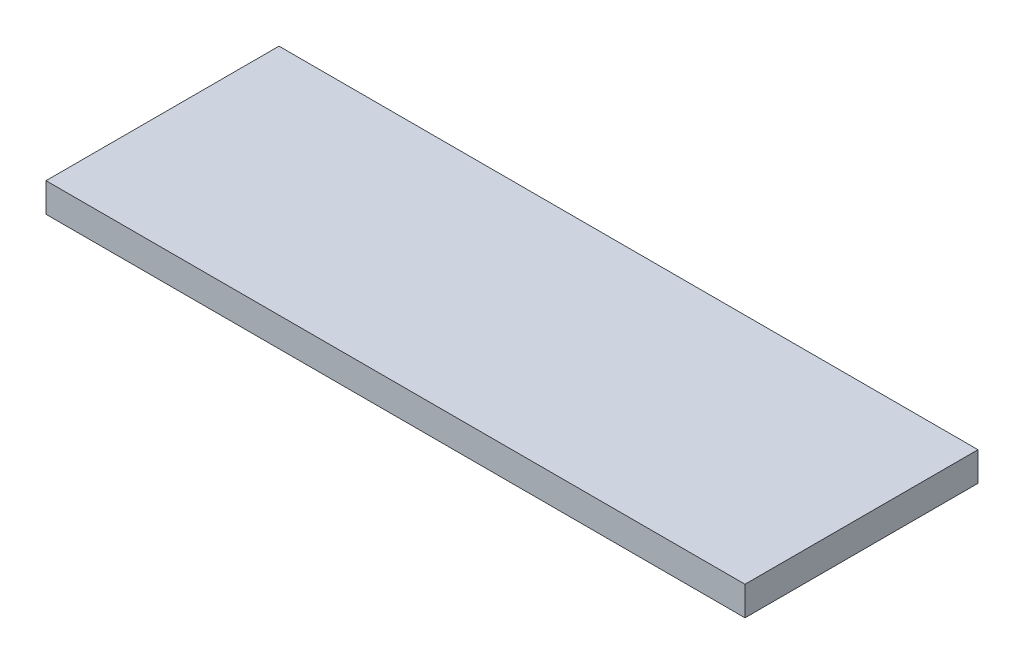
ISO-10303-21;
HEADER;
FILE_DESCRIPTION(('STEP AP214'),'2;1');
FILE_NAME('part.step','',(''),(''),'','','');
FILE_SCHEMA(('AUTOMOTIVE_DESIGN { 1 0 10303 214 1 1 1 1 }'));
ENDSEC;
DATA;
#1=APPLICATION_CONTEXT('core data for automotive mechanical design processes');
#2=APPLICATION_PROTOCOL_DEFINITION('international standard','automotive_design',2000,#1);
#3=PRODUCT_CONTEXT('',#1,'mechanical');
#4=PRODUCT('Part','Part','',(#3));
#5=PRODUCT_RELATED_PRODUCT_CATEGORY('part','',(#4));
#6=PRODUCT_DEFINITION_FORMATION('','',#4);
#7=PRODUCT_DEFINITION_CONTEXT('part definition',#1,'design');
#8=PRODUCT_DEFINITION('design','',#6,#7);
#9=PRODUCT_DEFINITION_SHAPE('','',#8);
#10=(LENGTH_UNIT() NAMED_UNIT(*) SI_UNIT(.MILLI.,.METRE.));
#11=(NAMED_UNIT(*) PLANE_ANGLE_UNIT() SI_UNIT($,.RADIAN.));
#12=(NAMED_UNIT(*) SI_UNIT($,.STERADIAN.) SOLID_ANGLE_UNIT());
#13=UNCERTAINTY_MEASURE_WITH_UNIT(LENGTH_MEASURE(1.E-05),#10,'distance_accuracy_value','');
#14=(GEOMETRIC_REPRESENTATION_CONTEXT(3) GLOBAL_UNCERTAINTY_ASSIGNED_CONTEXT((#13)) GLOBAL_UNIT_ASSIGNED_CONTEXT((#10,
#11,#12)) REPRESENTATION_CONTEXT('',''));
#15=CARTESIAN_POINT('',(0.,0.,0.));
#16=DIRECTION('',(0.,0.,1.));
#17=DIRECTION('',(1.,0.,0.));
#18=AXIS2_PLACEMENT_3D('',#15,#16,#17);
#19=CARTESIAN_POINT('',(114.3,9.525,38.1));
#20=DIRECTION('',(-1.,0.,0.));
#21=DIRECTION('',(0.,0.,1.));
#22=AXIS2_PLACEMENT_3D('',#19,#20,#21);
#23=PLANE('',#22);
#24=DIRECTION('',(0.,0.,-1.));
#25=VECTOR('',#24,1.);
#26=CARTESIAN_POINT('',(114.3,0.,38.1));
#27=LINE('',#26,#25);
#28=CARTESIAN_POINT('',(114.3,0.,38.1));
#29=VERTEX_POINT('',#28);
#30=CARTESIAN_POINT('',(114.3,0.,-38.1));
#31=VERTEX_POINT('',#30);
#32=EDGE_CURVE('E100',#29,#31,#27,.T.);
#33=ORIENTED_EDGE('',*,*,#32,.T.);
#34=DIRECTION('',(0.,-1.,0.));
#35=VECTOR('',#34,1.);
#36=CARTESIAN_POINT('',(114.3,9.525,-38.1));
#37=LINE('',#36,#35);
#38=CARTESIAN_POINT('',(114.3,9.525,-38.1));
#39=VERTEX_POINT('',#38);
#40=EDGE_CURVE('E11',#39,#31,#37,.T.);
#41=ORIENTED_EDGE('',*,*,#40,.F.);
#42=DIRECTION('',(0.,0.,-1.));
#43=VECTOR('',#42,1.);
#44=CARTESIAN_POINT('',(114.3,9.525,38.1));
#45=LINE('',#44,#43);
#46=CARTESIAN_POINT('',(114.3,9.525,38.1));
#47=VERTEX_POINT('',#46);
#48=EDGE_CURVE('E88',#47,#39,#45,.T.);
#49=ORIENTED_EDGE('',*,*,#48,.F.);
#50=DIRECTION('',(0.,-1.,0.));
#51=VECTOR('',#50,1.);
#52=CARTESIAN_POINT('',(114.3,9.525,38.1));
#53=LINE('',#52,#51);
#54=EDGE_CURVE('E96',#47,#29,#53,.T.);
#55=ORIENTED_EDGE('',*,*,#54,.T.);
#56=EDGE_LOOP('',(#33,#41,#49,#55));
#57=FACE_BOUND('',#56,.T.);
#58=ADVANCED_FACE('F37',(#57),#23,.F.);
#59=CARTESIAN_POINT('',(-114.3,9.525,-38.1));
#60=DIRECTION('',(0.,0.,1.));
#61=DIRECTION('',(1.,0.,0.));
#62=AXIS2_PLACEMENT_3D('',#59,#60,#61);
#63=PLANE('',#62);
#64=DIRECTION('',(-1.,0.,0.));
#65=VECTOR('',#64,1.);
#66=CARTESIAN_POINT('',(-114.3,0.,-38.1));
#67=LINE('',#66,#65);
#68=CARTESIAN_POINT('',(-114.3,0.,-38.1));
#69=VERTEX_POINT('',#68);
#70=EDGE_CURVE('E92',#31,#69,#67,.T.);
#71=ORIENTED_EDGE('',*,*,#70,.T.);
#72=DIRECTION('',(0.,-1.,0.));
#73=VECTOR('',#72,1.);
#74=CARTESIAN_POINT('',(-114.3,9.525,-38.1));
#75=LINE('',#74,#73);
#76=CARTESIAN_POINT('',(-114.3,9.525,-38.1));
#77=VERTEX_POINT('',#76);
#78=EDGE_CURVE('E45',#77,#69,#75,.T.);
#79=ORIENTED_EDGE('',*,*,#78,.F.);
#80=DIRECTION('',(-1.,0.,0.));
#81=VECTOR('',#80,1.);
#82=CARTESIAN_POINT('',(-114.3,9.525,-38.1));
#83=LINE('',#82,#81);
#84=EDGE_CURVE('E83',#39,#77,#83,.T.);
#85=ORIENTED_EDGE('',*,*,#84,.F.);
#86=ORIENTED_EDGE('',*,*,#40,.T.);
#87=EDGE_LOOP('',(#71,#79,#85,#86));
#88=FACE_BOUND('',#87,.T.);
#89=ADVANCED_FACE('F91',(#88),#63,.F.);
#90=CARTESIAN_POINT('',(-114.3,9.525,38.1));
#91=DIRECTION('',(1.,0.,0.));
#92=DIRECTION('',(0.,0.,-1.));
#93=AXIS2_PLACEMENT_3D('',#90,#91,#92);
#94=PLANE('',#93);
#95=DIRECTION('',(0.,0.,1.));
#96=VECTOR('',#95,1.);
#97=CARTESIAN_POINT('',(-114.3,0.,38.1));
#98=LINE('',#97,#96);
#99=CARTESIAN_POINT('',(-114.3,0.,38.1));
#100=VERTEX_POINT('',#99);
#101=EDGE_CURVE('E70',#69,#100,#98,.T.);
#102=ORIENTED_EDGE('',*,*,#101,.T.);
#103=DIRECTION('',(0.,-1.,0.));
#104=VECTOR('',#103,1.);
#105=CARTESIAN_POINT('',(-114.3,9.525,38.1));
#106=LINE('',#105,#104);
#107=CARTESIAN_POINT('',(-114.3,9.525,38.1));
#108=VERTEX_POINT('',#107);
#109=EDGE_CURVE('E93',#108,#100,#106,.T.);
#110=ORIENTED_EDGE('',*,*,#109,.F.);
#111=DIRECTION('',(0.,0.,1.));
#112=VECTOR('',#111,1.);
#113=CARTESIAN_POINT('',(-114.3,9.525,38.1));
#114=LINE('',#113,#112);
#115=EDGE_CURVE('E86',#77,#108,#114,.T.);
#116=ORIENTED_EDGE('',*,*,#115,.F.);
#117=ORIENTED_EDGE('',*,*,#78,.T.);
#118=EDGE_LOOP('',(#102,#110,#116,#117));
#119=FACE_BOUND('',#118,.T.);
#120=ADVANCED_FACE('F94',(#119),#94,.F.);
#121=CARTESIAN_POINT('',(-114.3,9.525,38.1));
#122=DIRECTION('',(0.,0.,-1.));
#123=DIRECTION('',(-1.,0.,0.));
#124=AXIS2_PLACEMENT_3D('',#121,#122,#123);
#125=PLANE('',#124);
#126=DIRECTION('',(1.,0.,0.));
#127=VECTOR('',#126,1.);
#128=CARTESIAN_POINT('',(-114.3,0.,38.1));
#129=LINE('',#128,#127);
#130=EDGE_CURVE('E76',#100,#29,#129,.T.);
#131=ORIENTED_EDGE('',*,*,#130,.T.);
#132=ORIENTED_EDGE('',*,*,#54,.F.);
#133=DIRECTION('',(1.,0.,0.));
#134=VECTOR('',#133,1.);
#135=CARTESIAN_POINT('',(-114.3,9.525,38.1));
#136=LINE('',#135,#134);
#137=EDGE_CURVE('E53',#108,#47,#136,.T.);
#138=ORIENTED_EDGE('',*,*,#137,.F.);
#139=ORIENTED_EDGE('',*,*,#109,.T.);
#140=EDGE_LOOP('',(#131,#132,#138,#139));
#141=FACE_BOUND('',#140,.T.);
#142=ADVANCED_FACE('F107',(#141),#125,.F.);
#143=CARTESIAN_POINT('',(0.,9.525,0.));
#144=DIRECTION('',(0.,-1.,0.));
#145=DIRECTION('',(0.,0.,-1.));
#146=AXIS2_PLACEMENT_3D('',#143,#144,#145);
#147=PLANE('',#146);
#148=ORIENTED_EDGE('',*,*,#48,.T.);
#149=ORIENTED_EDGE('',*,*,#84,.T.);
#150=ORIENTED_EDGE('',*,*,#115,.T.);
#151=ORIENTED_EDGE('',*,*,#137,.T.);
#152=EDGE_LOOP('',(#148,#149,#150,#151));
#153=FACE_BOUND('',#152,.T.);
#154=ADVANCED_FACE('F84',(#153),#147,.F.);
#155=CARTESIAN_POINT('',(0.,0.,0.));
#156=DIRECTION('',(0.,-1.,0.));
#157=DIRECTION('',(0.,0.,-1.));
#158=AXIS2_PLACEMENT_3D('',#155,#156,#157);
#159=PLANE('',#158);
#160=ORIENTED_EDGE('',*,*,#32,.F.);
#161=ORIENTED_EDGE('',*,*,#130,.F.);
#162=ORIENTED_EDGE('',*,*,#101,.F.);
#163=ORIENTED_EDGE('',*,*,#70,.F.);
#164=EDGE_LOOP('',(#160,#161,#162,#163));
#165=FACE_BOUND('',#164,.T.);
#166=ADVANCED_FACE('F110',(#165),#159,.T.);
#167=CLOSED_SHELL('',(#58,#89,#120,#142,#154,#166));
#168=MANIFOLD_SOLID_BREP('B2',#167);
#169=ADVANCED_BREP_SHAPE_REPRESENTATION('',(#18,#168),#14);
#170=SHAPE_DEFINITION_REPRESENTATION(#9,#169);
ENDSEC;
END-ISO-10303-21;
